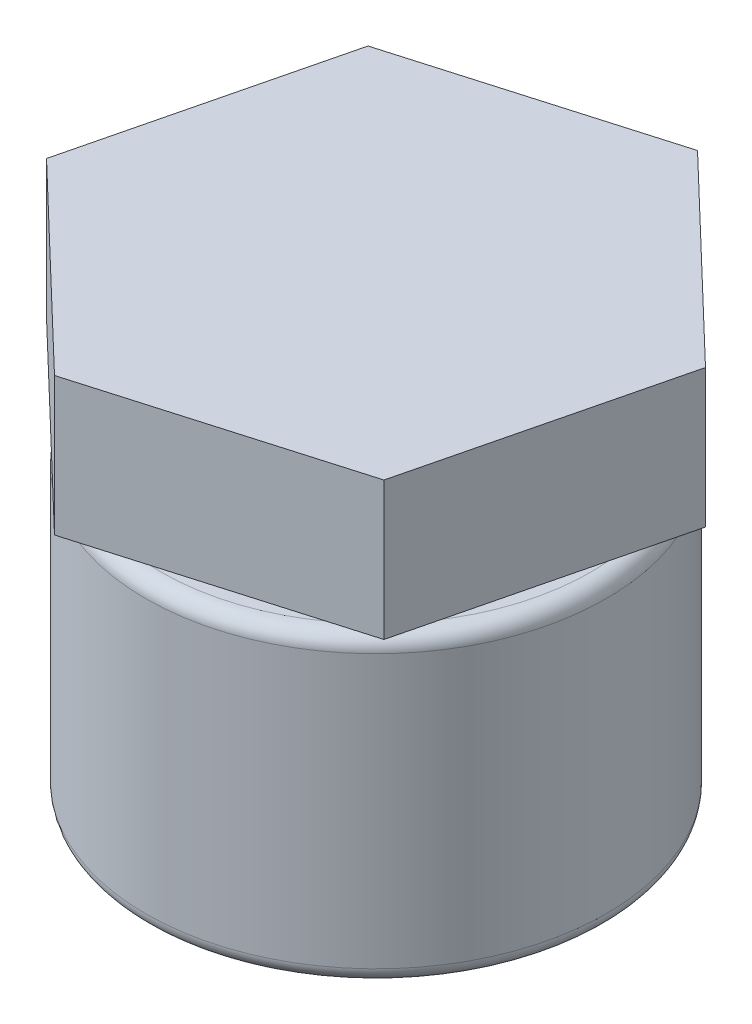
ISO-10303-21;
HEADER;
FILE_DESCRIPTION(('STEP AP214'),'2;1');
FILE_NAME('part.step','',(''),(''),'','','');
FILE_SCHEMA(('AUTOMOTIVE_DESIGN { 1 0 10303 214 1 1 1 1 }'));
ENDSEC;
DATA;
#1=APPLICATION_CONTEXT('core data for automotive mechanical design processes');
#2=APPLICATION_PROTOCOL_DEFINITION('international standard','automotive_design',2000,#1);
#3=PRODUCT_CONTEXT('',#1,'mechanical');
#4=PRODUCT('Part','Part','',(#3));
#5=PRODUCT_RELATED_PRODUCT_CATEGORY('part','',(#4));
#6=PRODUCT_DEFINITION_FORMATION('','',#4);
#7=PRODUCT_DEFINITION_CONTEXT('part definition',#1,'design');
#8=PRODUCT_DEFINITION('design','',#6,#7);
#9=PRODUCT_DEFINITION_SHAPE('','',#8);
#10=(LENGTH_UNIT() NAMED_UNIT(*) SI_UNIT(.MILLI.,.METRE.));
#11=(NAMED_UNIT(*) PLANE_ANGLE_UNIT() SI_UNIT($,.RADIAN.));
#12=(NAMED_UNIT(*) SI_UNIT($,.STERADIAN.) SOLID_ANGLE_UNIT());
#13=UNCERTAINTY_MEASURE_WITH_UNIT(LENGTH_MEASURE(1.E-05),#10,'distance_accuracy_value','');
#14=(GEOMETRIC_REPRESENTATION_CONTEXT(3) GLOBAL_UNCERTAINTY_ASSIGNED_CONTEXT((#13)) GLOBAL_UNIT_ASSIGNED_CONTEXT((#10,
#11,#12)) REPRESENTATION_CONTEXT('',''));
#15=CARTESIAN_POINT('',(0.,0.,0.));
#16=DIRECTION('',(0.,0.,1.));
#17=DIRECTION('',(1.,0.,0.));
#18=AXIS2_PLACEMENT_3D('',#15,#16,#17);
#19=CARTESIAN_POINT('',(41.2663349647183,99.3272448289383,-168.18867169723));
#20=DIRECTION('',(0.279232161018098,0.,0.960223619920466));
#21=DIRECTION('',(0.960223619920466,0.,-0.279232161018098));
#22=AXIS2_PLACEMENT_3D('',#19,#20,#21);
#23=PLANE('',#22);
#24=DIRECTION('',(-0.960223619920466,0.,0.279232161018098));
#25=VECTOR('',#24,1.);
#26=CARTESIAN_POINT('',(41.2663349647183,9.32724482893832,-168.18867169723));
#27=LINE('',#26,#25);
#28=CARTESIAN_POINT('',(41.2663349647183,9.32724482893832,-168.18867169723));
#29=VERTEX_POINT('',#28);
#30=CARTESIAN_POINT('',(-125.022494836202,9.32724482893832,-119.832030249139));
#31=VERTEX_POINT('',#30);
#32=EDGE_CURVE('E129',#29,#31,#27,.T.);
#33=ORIENTED_EDGE('',*,*,#32,.T.);
#34=DIRECTION('',(0.,-1.,0.));
#35=VECTOR('',#34,1.);
#36=CARTESIAN_POINT('',(-125.022494836202,99.3272448289383,-119.832030249139));
#37=LINE('',#36,#35);
#38=CARTESIAN_POINT('',(-125.022494836202,99.3272448289383,-119.832030249139));
#39=VERTEX_POINT('',#38);
#40=EDGE_CURVE('E12',#39,#31,#37,.T.);
#41=ORIENTED_EDGE('',*,*,#40,.F.);
#42=DIRECTION('',(-0.960223619920466,0.,0.279232161018098));
#43=VECTOR('',#42,1.);
#44=CARTESIAN_POINT('',(41.2663349647183,99.3272448289383,-168.18867169723));
#45=LINE('',#44,#43);
#46=CARTESIAN_POINT('',(41.2663349647183,99.3272448289383,-168.18867169723));
#47=VERTEX_POINT('',#46);
#48=EDGE_CURVE('E140',#47,#39,#45,.T.);
#49=ORIENTED_EDGE('',*,*,#48,.F.);
#50=DIRECTION('',(0.,-1.,0.));
#51=VECTOR('',#50,1.);
#52=CARTESIAN_POINT('',(41.2663349647183,99.3272448289383,-168.18867169723));
#53=LINE('',#52,#51);
#54=EDGE_CURVE('E125',#47,#29,#53,.T.);
#55=ORIENTED_EDGE('',*,*,#54,.T.);
#56=EDGE_LOOP('',(#33,#41,#49,#55));
#57=FACE_BOUND('',#56,.T.);
#58=ADVANCED_FACE('F45',(#57),#23,.F.);
#59=CARTESIAN_POINT('',(-125.022494836202,99.3272448289383,-119.832030249139));
#60=DIRECTION('',(0.971194128674025,0.,0.238289664964933));
#61=DIRECTION('',(0.238289664964934,0.,-0.971194128674026));
#62=AXIS2_PLACEMENT_3D('',#59,#60,#61);
#63=PLANE('',#62);
#64=DIRECTION('',(-0.238289664964934,0.,0.971194128674026));
#65=VECTOR('',#64,1.);
#66=CARTESIAN_POINT('',(-125.022494836202,9.32724482893832,-119.832030249139));
#67=LINE('',#66,#65);
#68=CARTESIAN_POINT('',(-166.288829800921,9.32724482893832,48.3566414480908));
#69=VERTEX_POINT('',#68);
#70=EDGE_CURVE('E132',#31,#69,#67,.T.);
#71=ORIENTED_EDGE('',*,*,#70,.T.);
#72=DIRECTION('',(0.,-1.,0.));
#73=VECTOR('',#72,1.);
#74=CARTESIAN_POINT('',(-166.288829800921,99.3272448289383,48.3566414480908));
#75=LINE('',#74,#73);
#76=CARTESIAN_POINT('',(-166.288829800921,99.3272448289383,48.3566414480908));
#77=VERTEX_POINT('',#76);
#78=EDGE_CURVE('E53',#77,#69,#75,.T.);
#79=ORIENTED_EDGE('',*,*,#78,.F.);
#80=DIRECTION('',(-0.238289664964934,0.,0.971194128674026));
#81=VECTOR('',#80,1.);
#82=CARTESIAN_POINT('',(-125.022494836202,99.3272448289383,-119.832030249139));
#83=LINE('',#82,#81);
#84=EDGE_CURVE('E98',#39,#77,#83,.T.);
#85=ORIENTED_EDGE('',*,*,#84,.F.);
#86=ORIENTED_EDGE('',*,*,#40,.T.);
#87=EDGE_LOOP('',(#71,#79,#85,#86));
#88=FACE_BOUND('',#87,.T.);
#89=ADVANCED_FACE('F165',(#88),#63,.F.);
#90=CARTESIAN_POINT('',(-166.288829800921,99.3272448289383,48.3566414480908));
#91=DIRECTION('',(0.691961967655928,0.,-0.721933954955532));
#92=DIRECTION('',(-0.721933954955532,0.,-0.691961967655928));
#93=AXIS2_PLACEMENT_3D('',#90,#91,#92);
#94=PLANE('',#93);
#95=DIRECTION('',(0.721933954955532,0.,0.691961967655928));
#96=VECTOR('',#95,1.);
#97=CARTESIAN_POINT('',(-166.288829800921,9.32724482893832,48.3566414480908));
#98=LINE('',#97,#96);
#99=CARTESIAN_POINT('',(-41.2663349647182,9.32724482893832,168.18867169723));
#100=VERTEX_POINT('',#99);
#101=EDGE_CURVE('E135',#69,#100,#98,.T.);
#102=ORIENTED_EDGE('',*,*,#101,.T.);
#103=DIRECTION('',(0.,-1.,0.));
#104=VECTOR('',#103,1.);
#105=CARTESIAN_POINT('',(-41.2663349647182,99.3272448289383,168.18867169723));
#106=LINE('',#105,#104);
#107=CARTESIAN_POINT('',(-41.2663349647182,99.3272448289383,168.18867169723));
#108=VERTEX_POINT('',#107);
#109=EDGE_CURVE('E120',#108,#100,#106,.T.);
#110=ORIENTED_EDGE('',*,*,#109,.F.);
#111=DIRECTION('',(0.721933954955532,0.,0.691961967655928));
#112=VECTOR('',#111,1.);
#113=CARTESIAN_POINT('',(-166.288829800921,99.3272448289383,48.3566414480908));
#114=LINE('',#113,#112);
#115=EDGE_CURVE('E111',#77,#108,#114,.T.);
#116=ORIENTED_EDGE('',*,*,#115,.F.);
#117=ORIENTED_EDGE('',*,*,#78,.T.);
#118=EDGE_LOOP('',(#102,#110,#116,#117));
#119=FACE_BOUND('',#118,.T.);
#120=ADVANCED_FACE('F146',(#119),#94,.F.);
#121=CARTESIAN_POINT('',(-41.2663349647182,99.3272448289383,168.18867169723));
#122=DIRECTION('',(-0.279232161018098,0.,-0.960223619920466));
#123=DIRECTION('',(-0.960223619920466,0.,0.279232161018098));
#124=AXIS2_PLACEMENT_3D('',#121,#122,#123);
#125=PLANE('',#124);
#126=DIRECTION('',(0.960223619920466,0.,-0.279232161018098));
#127=VECTOR('',#126,1.);
#128=CARTESIAN_POINT('',(-41.2663349647182,9.32724482893832,168.18867169723));
#129=LINE('',#128,#127);
#130=CARTESIAN_POINT('',(125.022494836203,9.32724482893832,119.832030249139));
#131=VERTEX_POINT('',#130);
#132=EDGE_CURVE('E119',#100,#131,#129,.T.);
#133=ORIENTED_EDGE('',*,*,#132,.T.);
#134=DIRECTION('',(0.,-1.,0.));
#135=VECTOR('',#134,1.);
#136=CARTESIAN_POINT('',(125.022494836203,99.3272448289383,119.832030249139));
#137=LINE('',#136,#135);
#138=CARTESIAN_POINT('',(125.022494836203,99.3272448289383,119.832030249139));
#139=VERTEX_POINT('',#138);
#140=EDGE_CURVE('E116',#139,#131,#137,.T.);
#141=ORIENTED_EDGE('',*,*,#140,.F.);
#142=DIRECTION('',(0.960223619920466,0.,-0.279232161018098));
#143=VECTOR('',#142,1.);
#144=CARTESIAN_POINT('',(-41.2663349647182,99.3272448289383,168.18867169723));
#145=LINE('',#144,#143);
#146=EDGE_CURVE('E105',#108,#139,#145,.T.);
#147=ORIENTED_EDGE('',*,*,#146,.F.);
#148=ORIENTED_EDGE('',*,*,#109,.T.);
#149=EDGE_LOOP('',(#133,#141,#147,#148));
#150=FACE_BOUND('',#149,.T.);
#151=ADVANCED_FACE('F117',(#150),#125,.F.);
#152=CARTESIAN_POINT('',(125.022494836203,99.3272448289383,119.832030249139));
#153=DIRECTION('',(-0.971194128674025,0.,-0.238289664964933));
#154=DIRECTION('',(-0.238289664964934,0.,0.971194128674026));
#155=AXIS2_PLACEMENT_3D('',#152,#153,#154);
#156=PLANE('',#155);
#157=DIRECTION('',(0.238289664964934,0.,-0.971194128674026));
#158=VECTOR('',#157,1.);
#159=CARTESIAN_POINT('',(125.022494836203,9.32724482893832,119.832030249139));
#160=LINE('',#159,#158);
#161=CARTESIAN_POINT('',(166.288829800921,9.32724482893832,-48.3566414480908));
#162=VERTEX_POINT('',#161);
#163=EDGE_CURVE('E84',#131,#162,#160,.T.);
#164=ORIENTED_EDGE('',*,*,#163,.T.);
#165=DIRECTION('',(0.,-1.,0.));
#166=VECTOR('',#165,1.);
#167=CARTESIAN_POINT('',(166.288829800921,99.3272448289383,-48.3566414480908));
#168=LINE('',#167,#166);
#169=CARTESIAN_POINT('',(166.288829800921,99.3272448289383,-48.3566414480908));
#170=VERTEX_POINT('',#169);
#171=EDGE_CURVE('E121',#170,#162,#168,.T.);
#172=ORIENTED_EDGE('',*,*,#171,.F.);
#173=DIRECTION('',(0.238289664964934,0.,-0.971194128674026));
#174=VECTOR('',#173,1.);
#175=CARTESIAN_POINT('',(125.022494836203,99.3272448289383,119.832030249139));
#176=LINE('',#175,#174);
#177=EDGE_CURVE('E109',#139,#170,#176,.T.);
#178=ORIENTED_EDGE('',*,*,#177,.F.);
#179=ORIENTED_EDGE('',*,*,#140,.T.);
#180=EDGE_LOOP('',(#164,#172,#178,#179));
#181=FACE_BOUND('',#180,.T.);
#182=ADVANCED_FACE('F123',(#181),#156,.F.);
#183=CARTESIAN_POINT('',(166.288829800921,99.3272448289383,-48.3566414480908));
#184=DIRECTION('',(-0.691961967655928,0.,0.721933954955532));
#185=DIRECTION('',(0.721933954955532,0.,0.691961967655928));
#186=AXIS2_PLACEMENT_3D('',#183,#184,#185);
#187=PLANE('',#186);
#188=DIRECTION('',(-0.721933954955532,0.,-0.691961967655928));
#189=VECTOR('',#188,1.);
#190=CARTESIAN_POINT('',(166.288829800921,9.32724482893832,-48.3566414480908));
#191=LINE('',#190,#189);
#192=EDGE_CURVE('E90',#162,#29,#191,.T.);
#193=ORIENTED_EDGE('',*,*,#192,.T.);
#194=ORIENTED_EDGE('',*,*,#54,.F.);
#195=DIRECTION('',(-0.721933954955532,0.,-0.691961967655928));
#196=VECTOR('',#195,1.);
#197=CARTESIAN_POINT('',(166.288829800921,99.3272448289383,-48.3566414480908));
#198=LINE('',#197,#196);
#199=EDGE_CURVE('E61',#170,#47,#198,.T.);
#200=ORIENTED_EDGE('',*,*,#199,.F.);
#201=ORIENTED_EDGE('',*,*,#171,.T.);
#202=EDGE_LOOP('',(#193,#194,#200,#201));
#203=FACE_BOUND('',#202,.T.);
#204=ADVANCED_FACE('F154',(#203),#187,.F.);
#205=CARTESIAN_POINT('',(0.,99.3272448289383,0.));
#206=DIRECTION('',(0.,1.,0.));
#207=DIRECTION('',(0.,0.,1.));
#208=AXIS2_PLACEMENT_3D('',#205,#206,#207);
#209=PLANE('',#208);
#210=ORIENTED_EDGE('',*,*,#48,.T.);
#211=ORIENTED_EDGE('',*,*,#84,.T.);
#212=ORIENTED_EDGE('',*,*,#115,.T.);
#213=ORIENTED_EDGE('',*,*,#146,.T.);
#214=ORIENTED_EDGE('',*,*,#177,.T.);
#215=ORIENTED_EDGE('',*,*,#199,.T.);
#216=EDGE_LOOP('',(#210,#211,#212,#213,#214,#215));
#217=FACE_BOUND('',#216,.T.);
#218=ADVANCED_FACE('F107',(#217),#209,.T.);
#219=CARTESIAN_POINT('',(0.,9.32724482893832,0.));
#220=DIRECTION('',(0.,1.,0.));
#221=DIRECTION('',(0.,0.,1.));
#222=AXIS2_PLACEMENT_3D('',#219,#220,#221);
#223=PLANE('',#222);
#224=ORIENTED_EDGE('',*,*,#32,.F.);
#225=ORIENTED_EDGE('',*,*,#192,.F.);
#226=ORIENTED_EDGE('',*,*,#163,.F.);
#227=ORIENTED_EDGE('',*,*,#132,.F.);
#228=ORIENTED_EDGE('',*,*,#101,.F.);
#229=ORIENTED_EDGE('',*,*,#70,.F.);
#230=EDGE_LOOP('',(#224,#225,#226,#227,#228,#229));
#231=FACE_BOUND('',#230,.T.);
#232=CARTESIAN_POINT('',(0.,9.32724482893832,0.));
#233=DIRECTION('',(0.,-1.,0.));
#234=DIRECTION('',(0.,0.,-1.));
#235=AXIS2_PLACEMENT_3D('',#232,#233,#234);
#236=CIRCLE('',#235,28.2478780308576);
#237=CARTESIAN_POINT('',(0.,9.32724482893832,-28.2478780308576));
#238=VERTEX_POINT('',#237);
#239=EDGE_CURVE('E250',#238,#238,#236,.T.);
#240=ORIENTED_EDGE('',*,*,#239,.F.);
#241=EDGE_LOOP('',(#240));
#242=FACE_BOUND('',#241,.T.);
#243=ADVANCED_FACE('F149',(#231,#242),#223,.F.);
#244=CARTESIAN_POINT('',(0.,66.5426817531027,0.));
#245=DIRECTION('',(0.,1.,0.));
#246=DIRECTION('',(0.,0.,1.));
#247=AXIS2_PLACEMENT_3D('',#244,#245,#246);
#248=PLANE('',#247);
#249=CARTESIAN_POINT('',(0.,66.5426817531027,0.));
#250=DIRECTION('',(0.,-1.,0.));
#251=DIRECTION('',(0.,0.,-1.));
#252=AXIS2_PLACEMENT_3D('',#249,#250,#251);
#253=CIRCLE('',#252,17.1816990084598);
#254=CARTESIAN_POINT('',(0.,66.5426817531027,-17.1816990084598));
#255=VERTEX_POINT('',#254);
#256=EDGE_CURVE('E133',#255,#255,#253,.T.);
#257=ORIENTED_EDGE('',*,*,#256,.T.);
#258=EDGE_LOOP('',(#257));
#259=FACE_BOUND('',#258,.T.);
#260=ADVANCED_FACE('F202',(#259),#248,.F.);
#261=CARTESIAN_POINT('',(0.,-11.3201603261026,0.));
#262=DIRECTION('',(0.,-1.,0.));
#263=DIRECTION('',(0.,0.,-1.));
#264=AXIS2_PLACEMENT_3D('',#261,#262,#263);
#265=CYLINDRICAL_SURFACE('',#264,17.1816990084598);
#266=ORIENTED_EDGE('',*,*,#256,.F.);
#267=EDGE_LOOP('',(#266));
#268=FACE_BOUND('',#267,.T.);
#269=CARTESIAN_POINT('',(0.,47.4496206013839,0.));
#270=DIRECTION('',(0.,-1.,0.));
#271=DIRECTION('',(0.,0.,-1.));
#272=AXIS2_PLACEMENT_3D('',#269,#270,#271);
#273=CIRCLE('',#272,17.1816990084598);
#274=CARTESIAN_POINT('',(0.,47.4496206013839,-17.1816990084598));
#275=VERTEX_POINT('',#274);
#276=EDGE_CURVE('E252',#275,#275,#273,.T.);
#277=ORIENTED_EDGE('',*,*,#276,.T.);
#278=EDGE_LOOP('',(#277));
#279=FACE_BOUND('',#278,.T.);
#280=ADVANCED_FACE('F210',(#268,#279),#265,.F.);
#281=CARTESIAN_POINT('',(17.1816990084598,47.4496206013839,0.));
#282=DIRECTION('',(0.,1.,0.));
#283=DIRECTION('',(0.,0.,1.));
#284=AXIS2_PLACEMENT_3D('',#281,#282,#283);
#285=PLANE('',#284);
#286=ORIENTED_EDGE('',*,*,#276,.F.);
#287=EDGE_LOOP('',(#286));
#288=FACE_BOUND('',#287,.T.);
#289=CARTESIAN_POINT('',(0.,47.4496206013839,0.));
#290=DIRECTION('',(0.,-1.,0.));
#291=DIRECTION('',(0.,0.,-1.));
#292=AXIS2_PLACEMENT_3D('',#289,#290,#291);
#293=CIRCLE('',#292,28.2478780308576);
#294=CARTESIAN_POINT('',(0.,47.4496206013839,-28.2478780308576));
#295=VERTEX_POINT('',#294);
#296=EDGE_CURVE('E247',#295,#295,#293,.T.);
#297=ORIENTED_EDGE('',*,*,#296,.T.);
#298=EDGE_LOOP('',(#297));
#299=FACE_BOUND('',#298,.T.);
#300=ADVANCED_FACE('F220',(#288,#299),#285,.F.);
#301=CARTESIAN_POINT('',(0.,-11.3201603261026,0.));
#302=DIRECTION('',(0.,-1.,0.));
#303=DIRECTION('',(0.,0.,-1.));
#304=AXIS2_PLACEMENT_3D('',#301,#302,#303);
#305=CYLINDRICAL_SURFACE('',#304,28.2478780308576);
#306=ORIENTED_EDGE('',*,*,#296,.F.);
#307=EDGE_LOOP('',(#306));
#308=FACE_BOUND('',#307,.T.);
#309=ORIENTED_EDGE('',*,*,#239,.T.);
#310=EDGE_LOOP('',(#309));
#311=FACE_BOUND('',#310,.T.);
#312=ADVANCED_FACE('F230',(#308,#311),#305,.F.);
#313=CLOSED_SHELL('',(#58,#89,#120,#151,#182,#204,#218,#243,#260,#280,#300,#312));
#314=MANIFOLD_SOLID_BREP('B2',#313);
#315=CARTESIAN_POINT('',(0.,66.5426817531027,0.));
#316=DIRECTION('',(0.,1.,0.));
#317=DIRECTION('',(0.,0.,1.));
#318=AXIS2_PLACEMENT_3D('',#315,#316,#317);
#319=PLANE('',#318);
#320=CARTESIAN_POINT('',(0.,66.5426817531027,0.));
#321=DIRECTION('',(0.,-1.,0.));
#322=DIRECTION('',(0.,0.,-1.));
#323=AXIS2_PLACEMENT_3D('',#320,#321,#322);
#324=CIRCLE('',#323,17.1816990084598);
#325=CARTESIAN_POINT('',(0.,66.5426817531027,-17.1816990084598));
#326=VERTEX_POINT('',#325);
#327=EDGE_CURVE('E303',#326,#326,#324,.T.);
#328=ORIENTED_EDGE('',*,*,#327,.F.);
#329=EDGE_LOOP('',(#328));
#330=FACE_BOUND('',#329,.T.);
#331=ADVANCED_FACE('F282',(#330),#319,.T.);
#332=CARTESIAN_POINT('',(0.,-11.3201603261026,0.));
#333=DIRECTION('',(0.,-1.,0.));
#334=DIRECTION('',(0.,0.,-1.));
#335=AXIS2_PLACEMENT_3D('',#332,#333,#334);
#336=CYLINDRICAL_SURFACE('',#335,17.1816990084598);
#337=ORIENTED_EDGE('',*,*,#327,.T.);
#338=EDGE_LOOP('',(#337));
#339=FACE_BOUND('',#338,.T.);
#340=CARTESIAN_POINT('',(0.,47.4496206013839,0.));
#341=DIRECTION('',(0.,-1.,0.));
#342=DIRECTION('',(0.,0.,-1.));
#343=AXIS2_PLACEMENT_3D('',#340,#341,#342);
#344=CIRCLE('',#343,17.1816990084598);
#345=CARTESIAN_POINT('',(0.,47.4496206013839,-17.1816990084598));
#346=VERTEX_POINT('',#345);
#347=EDGE_CURVE('E306',#346,#346,#344,.T.);
#348=ORIENTED_EDGE('',*,*,#347,.F.);
#349=EDGE_LOOP('',(#348));
#350=FACE_BOUND('',#349,.T.);
#351=ADVANCED_FACE('F384',(#339,#350),#336,.T.);
#352=CARTESIAN_POINT('',(17.1816990084598,47.4496206013839,0.));
#353=DIRECTION('',(0.,1.,0.));
#354=DIRECTION('',(0.,0.,1.));
#355=AXIS2_PLACEMENT_3D('',#352,#353,#354);
#356=PLANE('',#355);
#357=ORIENTED_EDGE('',*,*,#347,.T.);
#358=EDGE_LOOP('',(#357));
#359=FACE_BOUND('',#358,.T.);
#360=CARTESIAN_POINT('',(0.,47.4496206013839,0.));
#361=DIRECTION('',(0.,-1.,0.));
#362=DIRECTION('',(0.,0.,-1.));
#363=AXIS2_PLACEMENT_3D('',#360,#361,#362);
#364=CIRCLE('',#363,28.2478780308576);
#365=CARTESIAN_POINT('',(0.,47.4496206013839,-28.2478780308576));
#366=VERTEX_POINT('',#365);
#367=EDGE_CURVE('E309',#366,#366,#364,.T.);
#368=ORIENTED_EDGE('',*,*,#367,.F.);
#369=EDGE_LOOP('',(#368));
#370=FACE_BOUND('',#369,.T.);
#371=ADVANCED_FACE('F380',(#359,#370),#356,.T.);
#372=CARTESIAN_POINT('',(0.,-11.3201603261026,0.));
#373=DIRECTION('',(0.,-1.,0.));
#374=DIRECTION('',(0.,0.,-1.));
#375=AXIS2_PLACEMENT_3D('',#372,#373,#374);
#376=CYLINDRICAL_SURFACE('',#375,28.2478780308576);
#377=ORIENTED_EDGE('',*,*,#367,.T.);
#378=EDGE_LOOP('',(#377));
#379=FACE_BOUND('',#378,.T.);
#380=CARTESIAN_POINT('',(0.,9.32724482893832,0.));
#381=DIRECTION('',(0.,-1.,0.));
#382=DIRECTION('',(0.,0.,-1.));
#383=AXIS2_PLACEMENT_3D('',#380,#381,#382);
#384=CIRCLE('',#383,28.2478780308576);
#385=CARTESIAN_POINT('',(0.,9.32724482893832,-28.2478780308576));
#386=VERTEX_POINT('',#385);
#387=EDGE_CURVE('E312',#386,#386,#384,.T.);
#388=ORIENTED_EDGE('',*,*,#387,.F.);
#389=EDGE_LOOP('',(#388));
#390=FACE_BOUND('',#389,.T.);
#391=ADVANCED_FACE('F376',(#379,#390),#376,.T.);
#392=CARTESIAN_POINT('',(28.2478780308576,9.32724482893832,0.));
#393=DIRECTION('',(0.,1.,0.));
#394=DIRECTION('',(0.,0.,1.));
#395=AXIS2_PLACEMENT_3D('',#392,#393,#394);
#396=PLANE('',#395);
#397=ORIENTED_EDGE('',*,*,#387,.T.);
#398=EDGE_LOOP('',(#397));
#399=FACE_BOUND('',#398,.T.);
#400=CARTESIAN_POINT('',(0.,9.32724482893832,0.));
#401=DIRECTION('',(0.,-1.,0.));
#402=DIRECTION('',(0.,0.,-1.));
#403=AXIS2_PLACEMENT_3D('',#400,#401,#402);
#404=CIRCLE('',#403,30.1009020960252);
#405=CARTESIAN_POINT('',(0.,9.32724482893832,-30.1009020960252));
#406=VERTEX_POINT('',#405);
#407=EDGE_CURVE('E315',#406,#406,#404,.T.);
#408=ORIENTED_EDGE('',*,*,#407,.F.);
#409=EDGE_LOOP('',(#408));
#410=FACE_BOUND('',#409,.T.);
#411=ADVANCED_FACE('F372',(#399,#410),#396,.T.);
#412=CARTESIAN_POINT('',(0.,-11.3201603261026,0.));
#413=DIRECTION('',(0.,-1.,0.));
#414=DIRECTION('',(0.,0.,-1.));
#415=AXIS2_PLACEMENT_3D('',#412,#413,#414);
#416=CYLINDRICAL_SURFACE('',#415,30.1009020960252);
#417=ORIENTED_EDGE('',*,*,#407,.T.);
#418=EDGE_LOOP('',(#417));
#419=FACE_BOUND('',#418,.T.);
#420=CARTESIAN_POINT('',(0.,7.13477331707228,0.));
#421=DIRECTION('',(0.,-1.,0.));
#422=DIRECTION('',(0.,0.,-1.));
#423=AXIS2_PLACEMENT_3D('',#420,#421,#422);
#424=CIRCLE('',#423,30.1009020960252);
#425=CARTESIAN_POINT('',(0.,7.13477331707228,-30.1009020960252));
#426=VERTEX_POINT('',#425);
#427=EDGE_CURVE('E318',#426,#426,#424,.T.);
#428=ORIENTED_EDGE('',*,*,#427,.F.);
#429=EDGE_LOOP('',(#428));
#430=FACE_BOUND('',#429,.T.);
#431=ADVANCED_FACE('F368',(#419,#430),#416,.T.);
#432=CARTESIAN_POINT('',(30.1009020960252,7.13477331707228,0.));
#433=DIRECTION('',(0.,-1.,0.));
#434=DIRECTION('',(0.,0.,-1.));
#435=AXIS2_PLACEMENT_3D('',#432,#433,#434);
#436=PLANE('',#435);
#437=ORIENTED_EDGE('',*,*,#427,.T.);
#438=EDGE_LOOP('',(#437));
#439=FACE_BOUND('',#438,.T.);
#440=CARTESIAN_POINT('',(0.,7.13477331707228,0.));
#441=DIRECTION('',(0.,-1.,0.));
#442=DIRECTION('',(0.,0.,-1.));
#443=AXIS2_PLACEMENT_3D('',#440,#441,#442);
#444=CIRCLE('',#443,28.2478780308576);
#445=CARTESIAN_POINT('',(0.,7.13477331707228,-28.2478780308576));
#446=VERTEX_POINT('',#445);
#447=EDGE_CURVE('E321',#446,#446,#444,.T.);
#448=ORIENTED_EDGE('',*,*,#447,.F.);
#449=EDGE_LOOP('',(#448));
#450=FACE_BOUND('',#449,.T.);
#451=ADVANCED_FACE('F364',(#439,#450),#436,.T.);
#452=CARTESIAN_POINT('',(0.,-11.3201603261026,0.));
#453=DIRECTION('',(0.,-1.,0.));
#454=DIRECTION('',(0.,0.,-1.));
#455=AXIS2_PLACEMENT_3D('',#452,#453,#454);
#456=CYLINDRICAL_SURFACE('',#455,28.2478780308576);
#457=ORIENTED_EDGE('',*,*,#447,.T.);
#458=EDGE_LOOP('',(#457));
#459=FACE_BOUND('',#458,.T.);
#460=CARTESIAN_POINT('',(0.,-5.09626665505163,0.));
#461=DIRECTION('',(0.,-1.,0.));
#462=DIRECTION('',(0.,0.,-1.));
#463=AXIS2_PLACEMENT_3D('',#460,#461,#462);
#464=CIRCLE('',#463,28.2478780308576);
#465=CARTESIAN_POINT('',(0.,-5.09626665505163,-28.2478780308576));
#466=VERTEX_POINT('',#465);
#467=EDGE_CURVE('E324',#466,#466,#464,.T.);
#468=ORIENTED_EDGE('',*,*,#467,.F.);
#469=EDGE_LOOP('',(#468));
#470=FACE_BOUND('',#469,.T.);
#471=ADVANCED_FACE('F360',(#459,#470),#456,.T.);
#472=CARTESIAN_POINT('',(28.2478780308576,-5.09626665505163,0.));
#473=DIRECTION('',(0.,1.,0.));
#474=DIRECTION('',(0.,0.,1.));
#475=AXIS2_PLACEMENT_3D('',#472,#473,#474);
#476=PLANE('',#475);
#477=CARTESIAN_POINT('',(0.,-5.09626665505163,0.));
#478=DIRECTION('',(0.,1.,0.));
#479=DIRECTION('',(0.,0.,1.));
#480=AXIS2_PLACEMENT_3D('',#477,#478,#479);
#481=CIRCLE('',#480,139.975847277234);
#482=CARTESIAN_POINT('',(0.,-5.09626665505163,139.975847277234));
#483=VERTEX_POINT('',#482);
#484=EDGE_CURVE('E294',#483,#483,#481,.T.);
#485=ORIENTED_EDGE('',*,*,#484,.T.);
#486=EDGE_LOOP('',(#485));
#487=FACE_BOUND('',#486,.T.);
#488=ORIENTED_EDGE('',*,*,#467,.T.);
#489=EDGE_LOOP('',(#488));
#490=FACE_BOUND('',#489,.T.);
#491=ADVANCED_FACE('F357',(#487,#490),#476,.T.);
#492=CARTESIAN_POINT('',(0.,-11.3201603261026,0.));
#493=DIRECTION('',(0.,-1.,0.));
#494=DIRECTION('',(0.,0.,-1.));
#495=AXIS2_PLACEMENT_3D('',#492,#493,#494);
#496=CYLINDRICAL_SURFACE('',#495,149.975847277234);
#497=CARTESIAN_POINT('',(0.,-192.860033708305,0.));
#498=DIRECTION('',(0.,-1.,0.));
#499=DIRECTION('',(0.,0.,-1.));
#500=AXIS2_PLACEMENT_3D('',#497,#498,#499);
#501=CIRCLE('',#500,149.975847277234);
#502=CARTESIAN_POINT('',(0.,-192.860033708305,-149.975847277234));
#503=VERTEX_POINT('',#502);
#504=EDGE_CURVE('E44',#503,#503,#501,.F.);
#505=ORIENTED_EDGE('',*,*,#504,.T.);
#506=EDGE_LOOP('',(#505));
#507=FACE_BOUND('',#506,.T.);
#508=CARTESIAN_POINT('',(0.,-15.0962666550516,0.));
#509=DIRECTION('',(0.,1.,0.));
#510=DIRECTION('',(0.,0.,1.));
#511=AXIS2_PLACEMENT_3D('',#508,#509,#510);
#512=CIRCLE('',#511,149.975847277234);
#513=CARTESIAN_POINT('',(0.,-15.0962666550516,149.975847277234));
#514=VERTEX_POINT('',#513);
#515=EDGE_CURVE('E298',#514,#514,#512,.F.);
#516=ORIENTED_EDGE('',*,*,#515,.T.);
#517=EDGE_LOOP('',(#516));
#518=FACE_BOUND('',#517,.T.);
#519=ADVANCED_FACE('F354',(#507,#518),#496,.T.);
#520=CARTESIAN_POINT('',(149.975847277234,-202.860033708305,0.));
#521=DIRECTION('',(0.,-1.,0.));
#522=DIRECTION('',(0.,0.,-1.));
#523=AXIS2_PLACEMENT_3D('',#520,#521,#522);
#524=PLANE('',#523);
#525=CARTESIAN_POINT('',(0.,-202.860033708305,0.));
#526=DIRECTION('',(0.,-1.,0.));
#527=DIRECTION('',(0.,0.,-1.));
#528=AXIS2_PLACEMENT_3D('',#525,#526,#527);
#529=CIRCLE('',#528,139.975847277234);
#530=CARTESIAN_POINT('',(0.,-202.860033708305,-139.975847277234));
#531=VERTEX_POINT('',#530);
#532=EDGE_CURVE('E290',#531,#531,#529,.T.);
#533=ORIENTED_EDGE('',*,*,#532,.T.);
#534=EDGE_LOOP('',(#533));
#535=FACE_BOUND('',#534,.T.);
#536=ADVANCED_FACE('F350',(#535),#524,.T.);
#537=CARTESIAN_POINT('',(0.,-15.0962666550516,0.));
#538=DIRECTION('',(0.,1.,0.));
#539=DIRECTION('',(0.,0.,1.));
#540=AXIS2_PLACEMENT_3D('',#537,#538,#539);
#541=TOROIDAL_SURFACE('',#540,139.975847277234,10.);
#542=ORIENTED_EDGE('',*,*,#484,.F.);
#543=EDGE_LOOP('',(#542));
#544=FACE_BOUND('',#543,.T.);
#545=ORIENTED_EDGE('',*,*,#515,.F.);
#546=EDGE_LOOP('',(#545));
#547=FACE_BOUND('',#546,.T.);
#548=ADVANCED_FACE('F353',(#544,#547),#541,.T.);
#549=CARTESIAN_POINT('',(0.,-192.860033708305,0.));
#550=DIRECTION('',(0.,-1.,0.));
#551=DIRECTION('',(0.,0.,-1.));
#552=AXIS2_PLACEMENT_3D('',#549,#550,#551);
#553=TOROIDAL_SURFACE('',#552,139.975847277234,10.);
#554=ORIENTED_EDGE('',*,*,#504,.F.);
#555=EDGE_LOOP('',(#554));
#556=FACE_BOUND('',#555,.T.);
#557=ORIENTED_EDGE('',*,*,#532,.F.);
#558=EDGE_LOOP('',(#557));
#559=FACE_BOUND('',#558,.T.);
#560=ADVANCED_FACE('F284',(#556,#559),#553,.T.);
#561=CLOSED_SHELL('',(#331,#351,#371,#391,#411,#431,#451,#471,#491,#519,#536,#548,#560));
#562=CARTESIAN_POINT('',(0.,-186.007813088841,0.));
#563=DIRECTION('',(0.,1.,0.));
#564=DIRECTION('',(0.,0.,1.));
#565=AXIS2_PLACEMENT_3D('',#562,#563,#564);
#566=PLANE('',#565);
#567=CARTESIAN_POINT('',(0.,-186.007813088841,0.));
#568=DIRECTION('',(0.,-1.,0.));
#569=DIRECTION('',(0.,0.,-1.));
#570=AXIS2_PLACEMENT_3D('',#567,#568,#569);
#571=CIRCLE('',#570,141.152083847485);
#572=CARTESIAN_POINT('',(0.,-186.007813088841,-141.152083847485));
#573=VERTEX_POINT('',#572);
#574=EDGE_CURVE('E327',#573,#573,#571,.T.);
#575=ORIENTED_EDGE('',*,*,#574,.F.);
#576=EDGE_LOOP('',(#575));
#577=FACE_BOUND('',#576,.T.);
#578=ADVANCED_FACE('F338',(#577),#566,.T.);
#579=CARTESIAN_POINT('',(0.,-11.3201603261026,0.));
#580=DIRECTION('',(0.,-1.,0.));
#581=DIRECTION('',(0.,0.,-1.));
#582=AXIS2_PLACEMENT_3D('',#579,#580,#581);
#583=CYLINDRICAL_SURFACE('',#582,141.152083847485);
#584=ORIENTED_EDGE('',*,*,#574,.T.);
#585=EDGE_LOOP('',(#584));
#586=FACE_BOUND('',#585,.T.);
#587=CARTESIAN_POINT('',(0.,-11.3201603261026,0.));
#588=DIRECTION('',(0.,-1.,0.));
#589=DIRECTION('',(0.,0.,-1.));
#590=AXIS2_PLACEMENT_3D('',#587,#588,#589);
#591=CIRCLE('',#590,141.152083847485);
#592=CARTESIAN_POINT('',(0.,-11.3201603261026,-141.152083847485));
#593=VERTEX_POINT('',#592);
#594=EDGE_CURVE('E330',#593,#593,#591,.T.);
#595=ORIENTED_EDGE('',*,*,#594,.F.);
#596=EDGE_LOOP('',(#595));
#597=FACE_BOUND('',#596,.T.);
#598=ADVANCED_FACE('F336',(#586,#597),#583,.F.);
#599=CARTESIAN_POINT('',(141.152083847485,-11.3201603261026,0.));
#600=DIRECTION('',(0.,-1.,0.));
#601=DIRECTION('',(0.,0.,-1.));
#602=AXIS2_PLACEMENT_3D('',#599,#600,#601);
#603=PLANE('',#602);
#604=ORIENTED_EDGE('',*,*,#594,.T.);
#605=EDGE_LOOP('',(#604));
#606=FACE_BOUND('',#605,.T.);
#607=ADVANCED_FACE('F334',(#606),#603,.T.);
#608=CLOSED_SHELL('',(#578,#598,#607));
#609=ORIENTED_CLOSED_SHELL('',*,#608,.T.);
#610=BREP_WITH_VOIDS('B6',#561,(#609));
#611=ADVANCED_BREP_SHAPE_REPRESENTATION('',(#18,#314,#610),#14);
#612=SHAPE_DEFINITION_REPRESENTATION(#9,#611);
ENDSEC;
END-ISO-10303-21;
